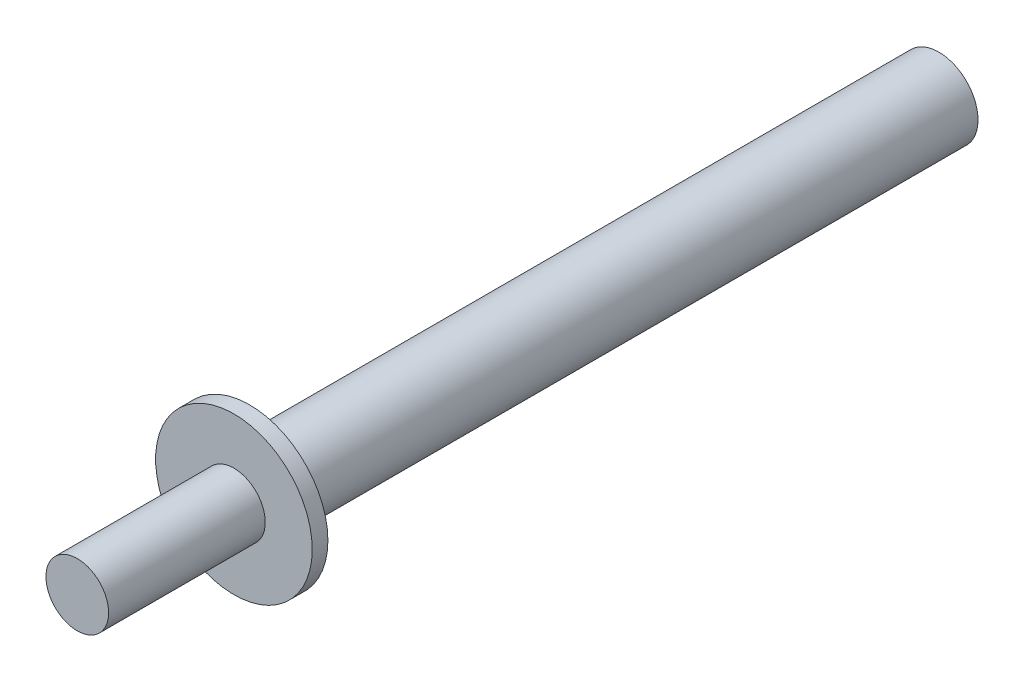
ISO-10303-21;
HEADER;
FILE_DESCRIPTION(('STEP AP214'),'2;1');
FILE_NAME('part.step','',(''),(''),'','','');
FILE_SCHEMA(('AUTOMOTIVE_DESIGN { 1 0 10303 214 1 1 1 1 }'));
ENDSEC;
DATA;
#1=APPLICATION_CONTEXT('core data for automotive mechanical design processes');
#2=APPLICATION_PROTOCOL_DEFINITION('international standard','automotive_design',2000,#1);
#3=PRODUCT_CONTEXT('',#1,'mechanical');
#4=PRODUCT('Part','Part','',(#3));
#5=PRODUCT_RELATED_PRODUCT_CATEGORY('part','',(#4));
#6=PRODUCT_DEFINITION_FORMATION('','',#4);
#7=PRODUCT_DEFINITION_CONTEXT('part definition',#1,'design');
#8=PRODUCT_DEFINITION('design','',#6,#7);
#9=PRODUCT_DEFINITION_SHAPE('','',#8);
#10=(LENGTH_UNIT() NAMED_UNIT(*) SI_UNIT(.MILLI.,.METRE.));
#11=(NAMED_UNIT(*) PLANE_ANGLE_UNIT() SI_UNIT($,.RADIAN.));
#12=(NAMED_UNIT(*) SI_UNIT($,.STERADIAN.) SOLID_ANGLE_UNIT());
#13=UNCERTAINTY_MEASURE_WITH_UNIT(LENGTH_MEASURE(1.E-05),#10,'distance_accuracy_value','');
#14=(GEOMETRIC_REPRESENTATION_CONTEXT(3) GLOBAL_UNCERTAINTY_ASSIGNED_CONTEXT((#13)) GLOBAL_UNIT_ASSIGNED_CONTEXT((#10,
#11,#12)) REPRESENTATION_CONTEXT('',''));
#15=CARTESIAN_POINT('',(0.,0.,0.));
#16=DIRECTION('',(0.,0.,1.));
#17=DIRECTION('',(1.,0.,0.));
#18=AXIS2_PLACEMENT_3D('',#15,#16,#17);
#19=CARTESIAN_POINT('',(0.,0.,22.));
#20=DIRECTION('',(0.,0.,-1.));
#21=DIRECTION('',(-1.,0.,0.));
#22=AXIS2_PLACEMENT_3D('',#19,#20,#21);
#23=CYLINDRICAL_SURFACE('',#22,1.25);
#24=CARTESIAN_POINT('',(0.,0.,22.));
#25=DIRECTION('',(0.,0.,1.));
#26=DIRECTION('',(1.,0.,0.));
#27=AXIS2_PLACEMENT_3D('',#24,#25,#26);
#28=CIRCLE('',#27,1.25);
#29=CARTESIAN_POINT('',(1.25,0.,22.));
#30=VERTEX_POINT('',#29);
#31=EDGE_CURVE('E10',#30,#30,#28,.T.);
#32=ORIENTED_EDGE('',*,*,#31,.F.);
#33=EDGE_LOOP('',(#32));
#34=FACE_BOUND('',#33,.T.);
#35=CARTESIAN_POINT('',(0.,0.,0.));
#36=DIRECTION('',(0.,0.,1.));
#37=DIRECTION('',(1.,0.,0.));
#38=AXIS2_PLACEMENT_3D('',#35,#36,#37);
#39=CIRCLE('',#38,1.25);
#40=CARTESIAN_POINT('',(1.25,0.,0.));
#41=VERTEX_POINT('',#40);
#42=EDGE_CURVE('E34',#41,#41,#39,.T.);
#43=ORIENTED_EDGE('',*,*,#42,.T.);
#44=EDGE_LOOP('',(#43));
#45=FACE_BOUND('',#44,.T.);
#46=ADVANCED_FACE('F31',(#34,#45),#23,.T.);
#47=CARTESIAN_POINT('',(0.,0.,0.));
#48=DIRECTION('',(0.,0.,1.));
#49=DIRECTION('',(1.,0.,0.));
#50=AXIS2_PLACEMENT_3D('',#47,#48,#49);
#51=PLANE('',#50);
#52=ORIENTED_EDGE('',*,*,#42,.F.);
#53=EDGE_LOOP('',(#52));
#54=FACE_BOUND('',#53,.T.);
#55=ADVANCED_FACE('F73',(#54),#51,.F.);
#56=CARTESIAN_POINT('',(0.,0.,22.5));
#57=DIRECTION('',(0.,0.,-1.));
#58=DIRECTION('',(-1.,0.,0.));
#59=AXIS2_PLACEMENT_3D('',#56,#57,#58);
#60=CYLINDRICAL_SURFACE('',#59,2.5);
#61=CARTESIAN_POINT('',(0.,0.,22.5));
#62=DIRECTION('',(0.,0.,1.));
#63=DIRECTION('',(1.,0.,0.));
#64=AXIS2_PLACEMENT_3D('',#61,#62,#63);
#65=CIRCLE('',#64,2.5);
#66=CARTESIAN_POINT('',(2.5,0.,22.5));
#67=VERTEX_POINT('',#66);
#68=EDGE_CURVE('E41',#67,#67,#65,.T.);
#69=ORIENTED_EDGE('',*,*,#68,.F.);
#70=EDGE_LOOP('',(#69));
#71=FACE_BOUND('',#70,.T.);
#72=CARTESIAN_POINT('',(0.,0.,22.));
#73=DIRECTION('',(0.,0.,1.));
#74=DIRECTION('',(1.,0.,0.));
#75=AXIS2_PLACEMENT_3D('',#72,#73,#74);
#76=CIRCLE('',#75,2.5);
#77=CARTESIAN_POINT('',(2.5,0.,22.));
#78=VERTEX_POINT('',#77);
#79=EDGE_CURVE('E43',#78,#78,#76,.T.);
#80=ORIENTED_EDGE('',*,*,#79,.T.);
#81=EDGE_LOOP('',(#80));
#82=FACE_BOUND('',#81,.T.);
#83=ADVANCED_FACE('F67',(#71,#82),#60,.T.);
#84=CARTESIAN_POINT('',(0.,0.,22.5));
#85=DIRECTION('',(0.,0.,1.));
#86=DIRECTION('',(1.,0.,0.));
#87=AXIS2_PLACEMENT_3D('',#84,#85,#86);
#88=PLANE('',#87);
#89=CARTESIAN_POINT('',(0.,0.,22.5));
#90=DIRECTION('',(0.,0.,1.));
#91=DIRECTION('',(1.,0.,0.));
#92=AXIS2_PLACEMENT_3D('',#89,#90,#91);
#93=CIRCLE('',#92,1.);
#94=CARTESIAN_POINT('',(1.,0.,22.5));
#95=VERTEX_POINT('',#94);
#96=EDGE_CURVE('E49',#95,#95,#93,.T.);
#97=ORIENTED_EDGE('',*,*,#96,.F.);
#98=EDGE_LOOP('',(#97));
#99=FACE_BOUND('',#98,.T.);
#100=ORIENTED_EDGE('',*,*,#68,.T.);
#101=EDGE_LOOP('',(#100));
#102=FACE_BOUND('',#101,.T.);
#103=ADVANCED_FACE('F64',(#99,#102),#88,.T.);
#104=CARTESIAN_POINT('',(0.,0.,22.));
#105=DIRECTION('',(0.,0.,1.));
#106=DIRECTION('',(1.,0.,0.));
#107=AXIS2_PLACEMENT_3D('',#104,#105,#106);
#108=PLANE('',#107);
#109=ORIENTED_EDGE('',*,*,#31,.T.);
#110=EDGE_LOOP('',(#109));
#111=FACE_BOUND('',#110,.T.);
#112=ORIENTED_EDGE('',*,*,#79,.F.);
#113=EDGE_LOOP('',(#112));
#114=FACE_BOUND('',#113,.T.);
#115=ADVANCED_FACE('F60',(#111,#114),#108,.F.);
#116=CARTESIAN_POINT('',(0.,0.,27.5));
#117=DIRECTION('',(0.,0.,-1.));
#118=DIRECTION('',(-1.,0.,0.));
#119=AXIS2_PLACEMENT_3D('',#116,#117,#118);
#120=CYLINDRICAL_SURFACE('',#119,1.);
#121=CARTESIAN_POINT('',(0.,0.,27.5));
#122=DIRECTION('',(0.,0.,1.));
#123=DIRECTION('',(1.,0.,0.));
#124=AXIS2_PLACEMENT_3D('',#121,#122,#123);
#125=CIRCLE('',#124,1.);
#126=CARTESIAN_POINT('',(1.,0.,27.5));
#127=VERTEX_POINT('',#126);
#128=EDGE_CURVE('E46',#127,#127,#125,.T.);
#129=ORIENTED_EDGE('',*,*,#128,.F.);
#130=EDGE_LOOP('',(#129));
#131=FACE_BOUND('',#130,.T.);
#132=ORIENTED_EDGE('',*,*,#96,.T.);
#133=EDGE_LOOP('',(#132));
#134=FACE_BOUND('',#133,.T.);
#135=ADVANCED_FACE('F57',(#131,#134),#120,.T.);
#136=CARTESIAN_POINT('',(0.,0.,27.5));
#137=DIRECTION('',(0.,0.,1.));
#138=DIRECTION('',(1.,0.,0.));
#139=AXIS2_PLACEMENT_3D('',#136,#137,#138);
#140=PLANE('',#139);
#141=ORIENTED_EDGE('',*,*,#128,.T.);
#142=EDGE_LOOP('',(#141));
#143=FACE_BOUND('',#142,.T.);
#144=ADVANCED_FACE('F55',(#143),#140,.T.);
#145=CLOSED_SHELL('',(#46,#55,#83,#103,#115,#135,#144));
#146=MANIFOLD_SOLID_BREP('B2',#145);
#147=ADVANCED_BREP_SHAPE_REPRESENTATION('',(#18,#146),#14);
#148=SHAPE_DEFINITION_REPRESENTATION(#9,#147);
ENDSEC;
END-ISO-10303-21;
